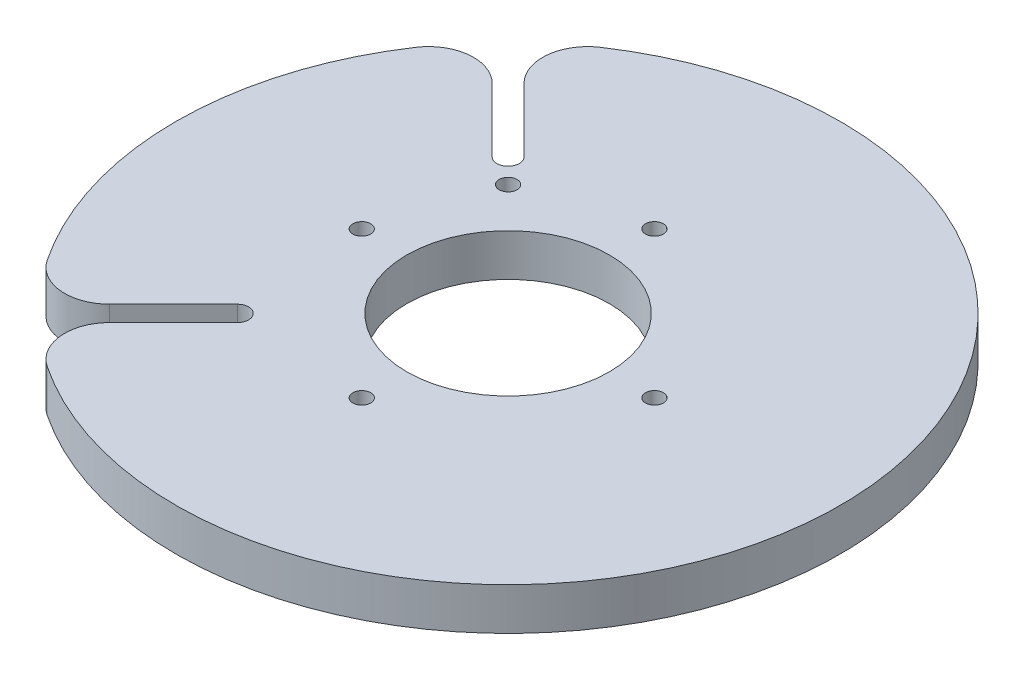
ISO-10303-21;
HEADER;
FILE_DESCRIPTION(('STEP AP214'),'2;1');
FILE_NAME('part.step','',(''),(''),'','','');
FILE_SCHEMA(('AUTOMOTIVE_DESIGN { 1 0 10303 214 1 1 1 1 }'));
ENDSEC;
DATA;
#1=APPLICATION_CONTEXT('core data for automotive mechanical design processes');
#2=APPLICATION_PROTOCOL_DEFINITION('international standard','automotive_design',2000,#1);
#3=PRODUCT_CONTEXT('',#1,'mechanical');
#4=PRODUCT('Part','Part','',(#3));
#5=PRODUCT_RELATED_PRODUCT_CATEGORY('part','',(#4));
#6=PRODUCT_DEFINITION_FORMATION('','',#4);
#7=PRODUCT_DEFINITION_CONTEXT('part definition',#1,'design');
#8=PRODUCT_DEFINITION('design','',#6,#7);
#9=PRODUCT_DEFINITION_SHAPE('','',#8);
#10=(LENGTH_UNIT() NAMED_UNIT(*) SI_UNIT(.MILLI.,.METRE.));
#11=(NAMED_UNIT(*) PLANE_ANGLE_UNIT() SI_UNIT($,.RADIAN.));
#12=(NAMED_UNIT(*) SI_UNIT($,.STERADIAN.) SOLID_ANGLE_UNIT());
#13=UNCERTAINTY_MEASURE_WITH_UNIT(LENGTH_MEASURE(1.E-05),#10,'distance_accuracy_value','');
#14=(GEOMETRIC_REPRESENTATION_CONTEXT(3) GLOBAL_UNCERTAINTY_ASSIGNED_CONTEXT((#13)) GLOBAL_UNIT_ASSIGNED_CONTEXT((#10,
#11,#12)) REPRESENTATION_CONTEXT('',''));
#15=CARTESIAN_POINT('',(0.,0.,0.));
#16=DIRECTION('',(0.,0.,1.));
#17=DIRECTION('',(1.,0.,0.));
#18=AXIS2_PLACEMENT_3D('',#15,#16,#17);
#19=CARTESIAN_POINT('',(0.,9.525,0.));
#20=DIRECTION('',(0.,-1.,0.));
#21=DIRECTION('',(0.,0.,-1.));
#22=AXIS2_PLACEMENT_3D('',#19,#20,#21);
#23=CYLINDRICAL_SURFACE('',#22,75.);
#24=CARTESIAN_POINT('',(0.,9.525,0.));
#25=DIRECTION('',(0.,1.,0.));
#26=DIRECTION('',(0.,0.,1.));
#27=AXIS2_PLACEMENT_3D('',#24,#25,#26);
#28=CIRCLE('',#27,75.);
#29=CARTESIAN_POINT('',(-41.6183838096098,9.525,62.393189765198));
#30=VERTEX_POINT('',#29);
#31=CARTESIAN_POINT('',(-41.6183838096098,9.525,-62.393189765198));
#32=VERTEX_POINT('',#31);
#33=EDGE_CURVE('E185',#30,#32,#28,.T.);
#34=ORIENTED_EDGE('',*,*,#33,.F.);
#35=DIRECTION('',(0.,-1.,0.));
#36=VECTOR('',#35,1.);
#37=CARTESIAN_POINT('',(-41.6183838096098,9.525,62.393189765198));
#38=LINE('',#37,#36);
#39=CARTESIAN_POINT('',(-41.6183838096098,0.,62.393189765198));
#40=VERTEX_POINT('',#39);
#41=EDGE_CURVE('E202',#30,#40,#38,.T.);
#42=ORIENTED_EDGE('',*,*,#41,.T.);
#43=CARTESIAN_POINT('',(0.,0.,0.));
#44=DIRECTION('',(0.,1.,0.));
#45=DIRECTION('',(0.,0.,1.));
#46=AXIS2_PLACEMENT_3D('',#43,#44,#45);
#47=CIRCLE('',#46,75.);
#48=CARTESIAN_POINT('',(-41.6183838096098,0.,-62.393189765198));
#49=VERTEX_POINT('',#48);
#50=EDGE_CURVE('E180',#40,#49,#47,.T.);
#51=ORIENTED_EDGE('',*,*,#50,.T.);
#52=DIRECTION('',(0.,-1.,0.));
#53=VECTOR('',#52,1.);
#54=CARTESIAN_POINT('',(-41.6183838096098,9.525,-62.393189765198));
#55=LINE('',#54,#53);
#56=EDGE_CURVE('E199',#49,#32,#55,.F.);
#57=ORIENTED_EDGE('',*,*,#56,.T.);
#58=EDGE_LOOP('',(#34,#42,#51,#57));
#59=FACE_BOUND('',#58,.T.);
#60=ADVANCED_FACE('F33',(#59),#23,.T.);
#61=CARTESIAN_POINT('',(-62.3931897651984,0.,-41.6183838096091));
#62=VERTEX_POINT('',#61);
#63=CARTESIAN_POINT('',(-62.3931897651984,0.,41.6183838096092));
#64=VERTEX_POINT('',#63);
#65=EDGE_CURVE('E186',#62,#64,#47,.T.);
#66=ORIENTED_EDGE('',*,*,#65,.T.);
#67=DIRECTION('',(0.,-1.,0.));
#68=VECTOR('',#67,1.);
#69=CARTESIAN_POINT('',(-62.3931897651984,9.525,41.6183838096092));
#70=LINE('',#69,#68);
#71=CARTESIAN_POINT('',(-62.3931897651984,9.525,41.6183838096092));
#72=VERTEX_POINT('',#71);
#73=EDGE_CURVE('E213',#64,#72,#70,.F.);
#74=ORIENTED_EDGE('',*,*,#73,.T.);
#75=CARTESIAN_POINT('',(-62.3931897651984,9.525,-41.6183838096091));
#76=VERTEX_POINT('',#75);
#77=EDGE_CURVE('E181',#76,#72,#28,.T.);
#78=ORIENTED_EDGE('',*,*,#77,.F.);
#79=DIRECTION('',(0.,-1.,0.));
#80=VECTOR('',#79,1.);
#81=CARTESIAN_POINT('',(-62.3931897651984,9.525,-41.6183838096091));
#82=LINE('',#81,#80);
#83=EDGE_CURVE('E211',#76,#62,#82,.T.);
#84=ORIENTED_EDGE('',*,*,#83,.T.);
#85=EDGE_LOOP('',(#66,#74,#78,#84));
#86=FACE_BOUND('',#85,.T.);
#87=ADVANCED_FACE('F251',(#86),#23,.T.);
#88=CARTESIAN_POINT('',(0.,9.525,0.));
#89=DIRECTION('',(0.,1.,0.));
#90=DIRECTION('',(0.,0.,1.));
#91=AXIS2_PLACEMENT_3D('',#88,#89,#90);
#92=PLANE('',#91);
#93=CARTESIAN_POINT('',(-25.1637927540144,9.52499999999999,-25.1637927540141));
#94=DIRECTION('',(0.,1.,0.));
#95=DIRECTION('',(0.,0.,1.));
#96=AXIS2_PLACEMENT_3D('',#93,#94,#95);
#97=CIRCLE('',#96,2.0193);
#98=CARTESIAN_POINT('',(-25.1637927540144,9.52499999999999,-23.1444927540141));
#99=VERTEX_POINT('',#98);
#100=EDGE_CURVE('E297',#99,#99,#97,.T.);
#101=ORIENTED_EDGE('',*,*,#100,.F.);
#102=EDGE_LOOP('',(#101));
#103=FACE_BOUND('',#102,.T.);
#104=CARTESIAN_POINT('',(-33.0199999999991,9.52499999999999,5.68989300120393E-13));
#105=DIRECTION('',(0.,1.,0.));
#106=DIRECTION('',(0.,0.,1.));
#107=AXIS2_PLACEMENT_3D('',#104,#105,#106);
#108=CIRCLE('',#107,2.0193);
#109=CARTESIAN_POINT('',(-33.0199999999991,9.52499999999999,2.01930000000057));
#110=VERTEX_POINT('',#109);
#111=EDGE_CURVE('E301',#110,#110,#108,.T.);
#112=ORIENTED_EDGE('',*,*,#111,.F.);
#113=EDGE_LOOP('',(#112));
#114=FACE_BOUND('',#113,.T.);
#115=CARTESIAN_POINT('',(1.63757896132211E-12,9.52499999999999,33.02));
#116=DIRECTION('',(0.,1.,0.));
#117=DIRECTION('',(0.,0.,1.));
#118=AXIS2_PLACEMENT_3D('',#115,#116,#117);
#119=CIRCLE('',#118,2.0193);
#120=CARTESIAN_POINT('',(1.63757896132211E-12,9.52499999999999,35.0393));
#121=VERTEX_POINT('',#120);
#122=EDGE_CURVE('E305',#121,#121,#119,.T.);
#123=ORIENTED_EDGE('',*,*,#122,.F.);
#124=EDGE_LOOP('',(#123));
#125=FACE_BOUND('',#124,.T.);
#126=CARTESIAN_POINT('',(33.0200000000009,9.52499999999999,-8.32667268468867E-13));
#127=DIRECTION('',(0.,1.,0.));
#128=DIRECTION('',(0.,0.,1.));
#129=AXIS2_PLACEMENT_3D('',#126,#127,#128);
#130=CIRCLE('',#129,2.01930000000001);
#131=CARTESIAN_POINT('',(33.0200000000009,9.52499999999999,2.01929999999917));
#132=VERTEX_POINT('',#131);
#133=EDGE_CURVE('E309',#132,#132,#130,.T.);
#134=ORIENTED_EDGE('',*,*,#133,.F.);
#135=EDGE_LOOP('',(#134));
#136=FACE_BOUND('',#135,.T.);
#137=CARTESIAN_POINT('',(0.,9.52499999999999,-33.02));
#138=DIRECTION('',(0.,1.,0.));
#139=DIRECTION('',(0.,0.,1.));
#140=AXIS2_PLACEMENT_3D('',#137,#138,#139);
#141=CIRCLE('',#140,2.01930000000001);
#142=CARTESIAN_POINT('',(0.,9.52499999999999,-31.0007));
#143=VERTEX_POINT('',#142);
#144=EDGE_CURVE('E313',#143,#143,#141,.T.);
#145=ORIENTED_EDGE('',*,*,#144,.F.);
#146=EDGE_LOOP('',(#145));
#147=FACE_BOUND('',#146,.T.);
#148=CARTESIAN_POINT('',(0.,9.52499999999999,0.));
#149=DIRECTION('',(0.,1.,0.));
#150=DIRECTION('',(0.,0.,1.));
#151=AXIS2_PLACEMENT_3D('',#148,#149,#150);
#152=CIRCLE('',#151,22.86);
#153=CARTESIAN_POINT('',(0.,9.52499999999999,22.86));
#154=VERTEX_POINT('',#153);
#155=EDGE_CURVE('E154',#154,#154,#152,.T.);
#156=ORIENTED_EDGE('',*,*,#155,.F.);
#157=EDGE_LOOP('',(#156));
#158=FACE_BOUND('',#157,.T.);
#159=DIRECTION('',(0.707106781186551,0.,-0.707106781186544));
#160=VECTOR('',#159,1.);
#161=CARTESIAN_POINT('',(-51.2065355051151,9.525,54.7986379535422));
#162=LINE('',#161,#160);
#163=CARTESIAN_POINT('',(-43.1646849797233,9.525,46.7567874281505));
#164=VERTEX_POINT('',#163);
#165=CARTESIAN_POINT('',(-28.7558952024421,9.525,32.3479976508694));
#166=VERTEX_POINT('',#165);
#167=EDGE_CURVE('E144',#164,#166,#162,.T.);
#168=ORIENTED_EDGE('',*,*,#167,.F.);
#169=CARTESIAN_POINT('',(-35.980480082868,9.525,53.9409923250058));
#170=DIRECTION('',(0.,1.,0.));
#171=DIRECTION('',(0.,0.,1.));
#172=AXIS2_PLACEMENT_3D('',#169,#170,#171);
#173=CIRCLE('',#172,10.16);
#174=EDGE_CURVE('E197',#164,#30,#173,.T.);
#175=ORIENTED_EDGE('',*,*,#174,.T.);
#176=ORIENTED_EDGE('',*,*,#33,.T.);
#177=CARTESIAN_POINT('',(-35.980480082868,9.525,-53.9409923250058));
#178=DIRECTION('',(0.,1.,0.));
#179=DIRECTION('',(0.,0.,1.));
#180=AXIS2_PLACEMENT_3D('',#177,#178,#179);
#181=CIRCLE('',#180,10.16);
#182=CARTESIAN_POINT('',(-43.1646849797233,9.525,-46.7567874281505));
#183=VERTEX_POINT('',#182);
#184=EDGE_CURVE('E191',#32,#183,#181,.T.);
#185=ORIENTED_EDGE('',*,*,#184,.T.);
#186=DIRECTION('',(-0.707106781186551,0.,-0.707106781186544));
#187=VECTOR('',#186,1.);
#188=CARTESIAN_POINT('',(-51.2065355051151,9.525,-54.7986379535422));
#189=LINE('',#188,#187);
#190=CARTESIAN_POINT('',(-28.7558952024421,9.525,-32.3479976508694));
#191=VERTEX_POINT('',#190);
#192=EDGE_CURVE('E171',#191,#183,#189,.T.);
#193=ORIENTED_EDGE('',*,*,#192,.F.);
#194=CARTESIAN_POINT('',(-30.5519464266559,9.525,-30.5519464266555));
#195=DIRECTION('',(0.,1.,0.));
#196=DIRECTION('',(0.,0.,1.));
#197=AXIS2_PLACEMENT_3D('',#194,#195,#196);
#198=CIRCLE('',#197,2.54);
#199=CARTESIAN_POINT('',(-32.3479976508697,9.525,-28.7558952024417));
#200=VERTEX_POINT('',#199);
#201=EDGE_CURVE('E168',#200,#191,#198,.T.);
#202=ORIENTED_EDGE('',*,*,#201,.F.);
#203=DIRECTION('',(0.707106781186551,0.,0.707106781186543));
#204=VECTOR('',#203,1.);
#205=CARTESIAN_POINT('',(-54.7986379535427,9.525,-51.2065355051145));
#206=LINE('',#205,#204);
#207=CARTESIAN_POINT('',(-46.7567874281509,9.525,-43.1646849797228));
#208=VERTEX_POINT('',#207);
#209=EDGE_CURVE('E166',#208,#200,#206,.T.);
#210=ORIENTED_EDGE('',*,*,#209,.F.);
#211=CARTESIAN_POINT('',(-53.9409923250062,9.525,-35.9804800828674));
#212=DIRECTION('',(0.,1.,0.));
#213=DIRECTION('',(0.,0.,1.));
#214=AXIS2_PLACEMENT_3D('',#211,#212,#213);
#215=CIRCLE('',#214,10.16);
#216=EDGE_CURVE('E193',#208,#76,#215,.T.);
#217=ORIENTED_EDGE('',*,*,#216,.T.);
#218=ORIENTED_EDGE('',*,*,#77,.T.);
#219=CARTESIAN_POINT('',(-53.9409923250062,9.525,35.9804800828674));
#220=DIRECTION('',(0.,1.,0.));
#221=DIRECTION('',(0.,0.,1.));
#222=AXIS2_PLACEMENT_3D('',#219,#220,#221);
#223=CIRCLE('',#222,10.16);
#224=CARTESIAN_POINT('',(-46.7567874281509,9.525,43.1646849797228));
#225=VERTEX_POINT('',#224);
#226=EDGE_CURVE('E195',#72,#225,#223,.T.);
#227=ORIENTED_EDGE('',*,*,#226,.T.);
#228=DIRECTION('',(-0.707106781186551,0.,0.707106781186544));
#229=VECTOR('',#228,1.);
#230=CARTESIAN_POINT('',(-54.7986379535427,9.525,51.2065355051145));
#231=LINE('',#230,#229);
#232=CARTESIAN_POINT('',(-32.3479976508697,9.525,28.7558952024417));
#233=VERTEX_POINT('',#232);
#234=EDGE_CURVE('E159',#233,#225,#231,.T.);
#235=ORIENTED_EDGE('',*,*,#234,.F.);
#236=CARTESIAN_POINT('',(-30.5519464266559,9.525,30.5519464266555));
#237=DIRECTION('',(0.,1.,0.));
#238=DIRECTION('',(0.,0.,-1.));
#239=AXIS2_PLACEMENT_3D('',#236,#237,#238);
#240=CIRCLE('',#239,2.53999999999999);
#241=EDGE_CURVE('E142',#166,#233,#240,.T.);
#242=ORIENTED_EDGE('',*,*,#241,.F.);
#243=EDGE_LOOP('',(#168,#175,#176,#185,#193,#202,#210,#217,#218,#227,#235,#242));
#244=FACE_BOUND('',#243,.T.);
#245=ADVANCED_FACE('F226',(#103,#114,#125,#136,#147,#158,#244),#92,.T.);
#246=CARTESIAN_POINT('',(0.,0.,0.));
#247=DIRECTION('',(0.,1.,0.));
#248=DIRECTION('',(0.,0.,1.));
#249=AXIS2_PLACEMENT_3D('',#246,#247,#248);
#250=PLANE('',#249);
#251=CARTESIAN_POINT('',(-25.1637927540144,0.,-25.1637927540141));
#252=DIRECTION('',(0.,1.,0.));
#253=DIRECTION('',(0.,0.,1.));
#254=AXIS2_PLACEMENT_3D('',#251,#252,#253);
#255=CIRCLE('',#254,2.0193);
#256=CARTESIAN_POINT('',(-25.1637927540144,0.,-23.1444927540141));
#257=VERTEX_POINT('',#256);
#258=EDGE_CURVE('E334',#257,#257,#255,.T.);
#259=ORIENTED_EDGE('',*,*,#258,.T.);
#260=EDGE_LOOP('',(#259));
#261=FACE_BOUND('',#260,.T.);
#262=CARTESIAN_POINT('',(-33.0199999999991,0.,5.68989300120393E-13));
#263=DIRECTION('',(0.,1.,0.));
#264=DIRECTION('',(0.,0.,1.));
#265=AXIS2_PLACEMENT_3D('',#262,#263,#264);
#266=CIRCLE('',#265,2.0193);
#267=CARTESIAN_POINT('',(-33.0199999999991,0.,2.01930000000057));
#268=VERTEX_POINT('',#267);
#269=EDGE_CURVE('E330',#268,#268,#266,.T.);
#270=ORIENTED_EDGE('',*,*,#269,.T.);
#271=EDGE_LOOP('',(#270));
#272=FACE_BOUND('',#271,.T.);
#273=CARTESIAN_POINT('',(1.63757896132211E-12,0.,33.02));
#274=DIRECTION('',(0.,1.,0.));
#275=DIRECTION('',(0.,0.,1.));
#276=AXIS2_PLACEMENT_3D('',#273,#274,#275);
#277=CIRCLE('',#276,2.0193);
#278=CARTESIAN_POINT('',(1.63757896132211E-12,0.,35.0393));
#279=VERTEX_POINT('',#278);
#280=EDGE_CURVE('E326',#279,#279,#277,.T.);
#281=ORIENTED_EDGE('',*,*,#280,.T.);
#282=EDGE_LOOP('',(#281));
#283=FACE_BOUND('',#282,.T.);
#284=CARTESIAN_POINT('',(33.0200000000009,0.,-8.32667268468867E-13));
#285=DIRECTION('',(0.,1.,0.));
#286=DIRECTION('',(0.,0.,1.));
#287=AXIS2_PLACEMENT_3D('',#284,#285,#286);
#288=CIRCLE('',#287,2.01930000000001);
#289=CARTESIAN_POINT('',(33.0200000000009,0.,2.01929999999917));
#290=VERTEX_POINT('',#289);
#291=EDGE_CURVE('E322',#290,#290,#288,.T.);
#292=ORIENTED_EDGE('',*,*,#291,.T.);
#293=EDGE_LOOP('',(#292));
#294=FACE_BOUND('',#293,.T.);
#295=CARTESIAN_POINT('',(0.,0.,-33.02));
#296=DIRECTION('',(0.,1.,0.));
#297=DIRECTION('',(0.,0.,1.));
#298=AXIS2_PLACEMENT_3D('',#295,#296,#297);
#299=CIRCLE('',#298,2.01930000000001);
#300=CARTESIAN_POINT('',(0.,0.,-31.0007));
#301=VERTEX_POINT('',#300);
#302=EDGE_CURVE('E317',#301,#301,#299,.T.);
#303=ORIENTED_EDGE('',*,*,#302,.T.);
#304=EDGE_LOOP('',(#303));
#305=FACE_BOUND('',#304,.T.);
#306=CARTESIAN_POINT('',(0.,0.,0.));
#307=DIRECTION('',(0.,1.,0.));
#308=DIRECTION('',(0.,0.,1.));
#309=AXIS2_PLACEMENT_3D('',#306,#307,#308);
#310=CIRCLE('',#309,22.86);
#311=CARTESIAN_POINT('',(0.,0.,22.86));
#312=VERTEX_POINT('',#311);
#313=EDGE_CURVE('E150',#312,#312,#310,.T.);
#314=ORIENTED_EDGE('',*,*,#313,.T.);
#315=EDGE_LOOP('',(#314));
#316=FACE_BOUND('',#315,.T.);
#317=ORIENTED_EDGE('',*,*,#50,.F.);
#318=CARTESIAN_POINT('',(-35.980480082868,0.,53.9409923250058));
#319=DIRECTION('',(0.,1.,0.));
#320=DIRECTION('',(0.,0.,1.));
#321=AXIS2_PLACEMENT_3D('',#318,#319,#320);
#322=CIRCLE('',#321,10.16);
#323=CARTESIAN_POINT('',(-43.1646849797233,0.,46.7567874281505));
#324=VERTEX_POINT('',#323);
#325=EDGE_CURVE('E209',#40,#324,#322,.F.);
#326=ORIENTED_EDGE('',*,*,#325,.T.);
#327=DIRECTION('',(-0.707106781186551,0.,0.707106781186544));
#328=VECTOR('',#327,1.);
#329=CARTESIAN_POINT('',(-51.2065355051151,0.,54.7986379535422));
#330=LINE('',#329,#328);
#331=CARTESIAN_POINT('',(-28.7558952024421,0.,32.3479976508694));
#332=VERTEX_POINT('',#331);
#333=EDGE_CURVE('E149',#332,#324,#330,.T.);
#334=ORIENTED_EDGE('',*,*,#333,.F.);
#335=CARTESIAN_POINT('',(-30.5519464266559,0.,30.5519464266555));
#336=DIRECTION('',(0.,1.,0.));
#337=DIRECTION('',(0.,0.,1.));
#338=AXIS2_PLACEMENT_3D('',#335,#336,#337);
#339=CIRCLE('',#338,2.53999999999999);
#340=CARTESIAN_POINT('',(-32.3479976508697,0.,28.7558952024417));
#341=VERTEX_POINT('',#340);
#342=EDGE_CURVE('E139',#341,#332,#339,.F.);
#343=ORIENTED_EDGE('',*,*,#342,.F.);
#344=DIRECTION('',(0.707106781186551,0.,-0.707106781186544));
#345=VECTOR('',#344,1.);
#346=CARTESIAN_POINT('',(-54.7986379535427,0.,51.2065355051145));
#347=LINE('',#346,#345);
#348=CARTESIAN_POINT('',(-46.7567874281509,0.,43.1646849797228));
#349=VERTEX_POINT('',#348);
#350=EDGE_CURVE('E122',#349,#341,#347,.T.);
#351=ORIENTED_EDGE('',*,*,#350,.F.);
#352=CARTESIAN_POINT('',(-53.9409923250062,0.,35.9804800828674));
#353=DIRECTION('',(0.,1.,0.));
#354=DIRECTION('',(0.,0.,1.));
#355=AXIS2_PLACEMENT_3D('',#352,#353,#354);
#356=CIRCLE('',#355,10.16);
#357=EDGE_CURVE('E207',#349,#64,#356,.F.);
#358=ORIENTED_EDGE('',*,*,#357,.T.);
#359=ORIENTED_EDGE('',*,*,#65,.F.);
#360=CARTESIAN_POINT('',(-53.9409923250062,0.,-35.9804800828674));
#361=DIRECTION('',(0.,1.,0.));
#362=DIRECTION('',(0.,0.,1.));
#363=AXIS2_PLACEMENT_3D('',#360,#361,#362);
#364=CIRCLE('',#363,10.16);
#365=CARTESIAN_POINT('',(-46.7567874281509,0.,-43.1646849797228));
#366=VERTEX_POINT('',#365);
#367=EDGE_CURVE('E54',#62,#366,#364,.F.);
#368=ORIENTED_EDGE('',*,*,#367,.T.);
#369=DIRECTION('',(-0.707106781186551,0.,-0.707106781186544));
#370=VECTOR('',#369,1.);
#371=CARTESIAN_POINT('',(-54.7986379535427,0.,-51.2065355051145));
#372=LINE('',#371,#370);
#373=CARTESIAN_POINT('',(-32.3479976508697,0.,-28.7558952024417));
#374=VERTEX_POINT('',#373);
#375=EDGE_CURVE('E176',#374,#366,#372,.T.);
#376=ORIENTED_EDGE('',*,*,#375,.F.);
#377=CARTESIAN_POINT('',(-30.5519464266559,0.,-30.5519464266555));
#378=DIRECTION('',(0.,1.,0.));
#379=DIRECTION('',(0.,0.,1.));
#380=AXIS2_PLACEMENT_3D('',#377,#378,#379);
#381=CIRCLE('',#380,2.54);
#382=CARTESIAN_POINT('',(-28.7558952024421,0.,-32.3479976508694));
#383=VERTEX_POINT('',#382);
#384=EDGE_CURVE('E132',#383,#374,#381,.F.);
#385=ORIENTED_EDGE('',*,*,#384,.F.);
#386=DIRECTION('',(0.707106781186551,0.,0.707106781186544));
#387=VECTOR('',#386,1.);
#388=CARTESIAN_POINT('',(-51.2065355051151,0.,-54.7986379535422));
#389=LINE('',#388,#387);
#390=CARTESIAN_POINT('',(-43.1646849797233,0.,-46.7567874281505));
#391=VERTEX_POINT('',#390);
#392=EDGE_CURVE('E164',#391,#383,#389,.T.);
#393=ORIENTED_EDGE('',*,*,#392,.F.);
#394=CARTESIAN_POINT('',(-35.980480082868,0.,-53.9409923250058));
#395=DIRECTION('',(0.,1.,0.));
#396=DIRECTION('',(0.,0.,1.));
#397=AXIS2_PLACEMENT_3D('',#394,#395,#396);
#398=CIRCLE('',#397,10.16);
#399=EDGE_CURVE('E204',#391,#49,#398,.F.);
#400=ORIENTED_EDGE('',*,*,#399,.T.);
#401=EDGE_LOOP('',(#317,#326,#334,#343,#351,#358,#359,#368,#376,#385,#393,#400));
#402=FACE_BOUND('',#401,.T.);
#403=ADVANCED_FACE('F147',(#261,#272,#283,#294,#305,#316,#402),#250,.F.);
#404=CARTESIAN_POINT('',(-51.2065355051151,-0.000999999999999265,-54.7986379535422));
#405=DIRECTION('',(0.707106781186544,0.,-0.707106781186551));
#406=DIRECTION('',(-0.707106781186551,0.,-0.707106781186544));
#407=AXIS2_PLACEMENT_3D('',#404,#405,#406);
#408=PLANE('',#407);
#409=ORIENTED_EDGE('',*,*,#192,.T.);
#410=DIRECTION('',(0.,-1.,0.));
#411=VECTOR('',#410,1.);
#412=CARTESIAN_POINT('',(-43.1646849797233,-0.000999999999999265,-46.7567874281505));
#413=LINE('',#412,#411);
#414=EDGE_CURVE('E11',#183,#391,#413,.T.);
#415=ORIENTED_EDGE('',*,*,#414,.T.);
#416=ORIENTED_EDGE('',*,*,#392,.T.);
#417=DIRECTION('',(0.,1.,0.));
#418=VECTOR('',#417,1.);
#419=CARTESIAN_POINT('',(-28.7558952024421,-0.000999999999999265,-32.3479976508694));
#420=LINE('',#419,#418);
#421=EDGE_CURVE('E174',#383,#191,#420,.T.);
#422=ORIENTED_EDGE('',*,*,#421,.T.);
#423=EDGE_LOOP('',(#409,#415,#416,#422));
#424=FACE_BOUND('',#423,.T.);
#425=ADVANCED_FACE('F282',(#424),#408,.F.);
#426=CARTESIAN_POINT('',(-30.5519464266559,-0.000999999999999265,-30.5519464266555));
#427=DIRECTION('',(0.,1.,0.));
#428=DIRECTION('',(0.,0.,1.));
#429=AXIS2_PLACEMENT_3D('',#426,#427,#428);
#430=CYLINDRICAL_SURFACE('',#429,2.54);
#431=ORIENTED_EDGE('',*,*,#384,.T.);
#432=DIRECTION('',(0.,1.,0.));
#433=VECTOR('',#432,1.);
#434=CARTESIAN_POINT('',(-32.3479976508697,-0.000999999999999265,-28.7558952024417));
#435=LINE('',#434,#433);
#436=EDGE_CURVE('E173',#374,#200,#435,.T.);
#437=ORIENTED_EDGE('',*,*,#436,.T.);
#438=ORIENTED_EDGE('',*,*,#201,.T.);
#439=ORIENTED_EDGE('',*,*,#421,.F.);
#440=EDGE_LOOP('',(#431,#437,#438,#439));
#441=FACE_BOUND('',#440,.T.);
#442=ADVANCED_FACE('F231',(#441),#430,.F.);
#443=CARTESIAN_POINT('',(-54.7986379535427,-0.000999999999999265,-51.2065355051145));
#444=DIRECTION('',(-0.707106781186544,0.,0.707106781186551));
#445=DIRECTION('',(0.707106781186551,0.,0.707106781186544));
#446=AXIS2_PLACEMENT_3D('',#443,#444,#445);
#447=PLANE('',#446);
#448=ORIENTED_EDGE('',*,*,#375,.T.);
#449=DIRECTION('',(0.,-1.,0.));
#450=VECTOR('',#449,1.);
#451=CARTESIAN_POINT('',(-46.7567874281509,-0.000999999999999265,-43.1646849797228));
#452=LINE('',#451,#450);
#453=EDGE_CURVE('E41',#366,#208,#452,.F.);
#454=ORIENTED_EDGE('',*,*,#453,.T.);
#455=ORIENTED_EDGE('',*,*,#209,.T.);
#456=ORIENTED_EDGE('',*,*,#436,.F.);
#457=EDGE_LOOP('',(#448,#454,#455,#456));
#458=FACE_BOUND('',#457,.T.);
#459=ADVANCED_FACE('F220',(#458),#447,.F.);
#460=CARTESIAN_POINT('',(-30.5519464266559,-0.000999999999999265,30.5519464266555));
#461=DIRECTION('',(0.,1.,0.));
#462=DIRECTION('',(0.,0.,1.));
#463=AXIS2_PLACEMENT_3D('',#460,#461,#462);
#464=CYLINDRICAL_SURFACE('',#463,2.53999999999999);
#465=ORIENTED_EDGE('',*,*,#342,.T.);
#466=DIRECTION('',(0.,1.,0.));
#467=VECTOR('',#466,1.);
#468=CARTESIAN_POINT('',(-28.7558952024421,-0.000999999999999265,32.3479976508694));
#469=LINE('',#468,#467);
#470=EDGE_CURVE('E133',#332,#166,#469,.T.);
#471=ORIENTED_EDGE('',*,*,#470,.T.);
#472=ORIENTED_EDGE('',*,*,#241,.T.);
#473=DIRECTION('',(0.,1.,0.));
#474=VECTOR('',#473,1.);
#475=CARTESIAN_POINT('',(-32.3479976508697,-0.000999999999999265,28.7558952024417));
#476=LINE('',#475,#474);
#477=EDGE_CURVE('E126',#341,#233,#476,.T.);
#478=ORIENTED_EDGE('',*,*,#477,.F.);
#479=EDGE_LOOP('',(#465,#471,#472,#478));
#480=FACE_BOUND('',#479,.T.);
#481=ADVANCED_FACE('F137',(#480),#464,.F.);
#482=CARTESIAN_POINT('',(-51.2065355051151,-0.000999999999999265,54.7986379535422));
#483=DIRECTION('',(0.707106781186544,0.,0.707106781186551));
#484=DIRECTION('',(0.707106781186551,0.,-0.707106781186544));
#485=AXIS2_PLACEMENT_3D('',#482,#483,#484);
#486=PLANE('',#485);
#487=ORIENTED_EDGE('',*,*,#333,.T.);
#488=DIRECTION('',(0.,-1.,0.));
#489=VECTOR('',#488,1.);
#490=CARTESIAN_POINT('',(-43.1646849797233,-0.000999999999999265,46.7567874281505));
#491=LINE('',#490,#489);
#492=EDGE_CURVE('E184',#324,#164,#491,.F.);
#493=ORIENTED_EDGE('',*,*,#492,.T.);
#494=ORIENTED_EDGE('',*,*,#167,.T.);
#495=ORIENTED_EDGE('',*,*,#470,.F.);
#496=EDGE_LOOP('',(#487,#493,#494,#495));
#497=FACE_BOUND('',#496,.T.);
#498=ADVANCED_FACE('F246',(#497),#486,.F.);
#499=CARTESIAN_POINT('',(-54.7986379535427,-0.000999999999999265,51.2065355051145));
#500=DIRECTION('',(-0.707106781186544,0.,-0.707106781186551));
#501=DIRECTION('',(-0.707106781186551,0.,0.707106781186544));
#502=AXIS2_PLACEMENT_3D('',#499,#500,#501);
#503=PLANE('',#502);
#504=ORIENTED_EDGE('',*,*,#234,.T.);
#505=DIRECTION('',(0.,-1.,0.));
#506=VECTOR('',#505,1.);
#507=CARTESIAN_POINT('',(-46.7567874281509,-0.000999999999999265,43.1646849797228));
#508=LINE('',#507,#506);
#509=EDGE_CURVE('E129',#225,#349,#508,.T.);
#510=ORIENTED_EDGE('',*,*,#509,.T.);
#511=ORIENTED_EDGE('',*,*,#350,.T.);
#512=ORIENTED_EDGE('',*,*,#477,.T.);
#513=EDGE_LOOP('',(#504,#510,#511,#512));
#514=FACE_BOUND('',#513,.T.);
#515=ADVANCED_FACE('F125',(#514),#503,.F.);
#516=CARTESIAN_POINT('',(-35.980480082868,9.525,53.9409923250058));
#517=DIRECTION('',(0.,-1.,0.));
#518=DIRECTION('',(0.,0.,-1.));
#519=AXIS2_PLACEMENT_3D('',#516,#517,#518);
#520=CYLINDRICAL_SURFACE('',#519,10.16);
#521=ORIENTED_EDGE('',*,*,#325,.F.);
#522=ORIENTED_EDGE('',*,*,#41,.F.);
#523=ORIENTED_EDGE('',*,*,#174,.F.);
#524=ORIENTED_EDGE('',*,*,#492,.F.);
#525=EDGE_LOOP('',(#521,#522,#523,#524));
#526=FACE_BOUND('',#525,.T.);
#527=ADVANCED_FACE('F244',(#526),#520,.T.);
#528=CARTESIAN_POINT('',(-53.9409923250062,9.525,35.9804800828674));
#529=DIRECTION('',(0.,-1.,0.));
#530=DIRECTION('',(0.,0.,-1.));
#531=AXIS2_PLACEMENT_3D('',#528,#529,#530);
#532=CYLINDRICAL_SURFACE('',#531,10.16);
#533=ORIENTED_EDGE('',*,*,#357,.F.);
#534=ORIENTED_EDGE('',*,*,#509,.F.);
#535=ORIENTED_EDGE('',*,*,#226,.F.);
#536=ORIENTED_EDGE('',*,*,#73,.F.);
#537=EDGE_LOOP('',(#533,#534,#535,#536));
#538=FACE_BOUND('',#537,.T.);
#539=ADVANCED_FACE('F248',(#538),#532,.T.);
#540=CARTESIAN_POINT('',(-53.9409923250062,9.525,-35.9804800828674));
#541=DIRECTION('',(0.,-1.,0.));
#542=DIRECTION('',(0.,0.,-1.));
#543=AXIS2_PLACEMENT_3D('',#540,#541,#542);
#544=CYLINDRICAL_SURFACE('',#543,10.16);
#545=ORIENTED_EDGE('',*,*,#367,.F.);
#546=ORIENTED_EDGE('',*,*,#83,.F.);
#547=ORIENTED_EDGE('',*,*,#216,.F.);
#548=ORIENTED_EDGE('',*,*,#453,.F.);
#549=EDGE_LOOP('',(#545,#546,#547,#548));
#550=FACE_BOUND('',#549,.T.);
#551=ADVANCED_FACE('F253',(#550),#544,.T.);
#552=CARTESIAN_POINT('',(-35.980480082868,9.525,-53.9409923250058));
#553=DIRECTION('',(0.,-1.,0.));
#554=DIRECTION('',(0.,0.,-1.));
#555=AXIS2_PLACEMENT_3D('',#552,#553,#554);
#556=CYLINDRICAL_SURFACE('',#555,10.16);
#557=ORIENTED_EDGE('',*,*,#399,.F.);
#558=ORIENTED_EDGE('',*,*,#414,.F.);
#559=ORIENTED_EDGE('',*,*,#184,.F.);
#560=ORIENTED_EDGE('',*,*,#56,.F.);
#561=EDGE_LOOP('',(#557,#558,#559,#560));
#562=FACE_BOUND('',#561,.T.);
#563=ADVANCED_FACE('F35',(#562),#556,.T.);
#564=CARTESIAN_POINT('',(0.,0.,0.));
#565=DIRECTION('',(0.,1.,0.));
#566=DIRECTION('',(0.,0.,1.));
#567=AXIS2_PLACEMENT_3D('',#564,#565,#566);
#568=CYLINDRICAL_SURFACE('',#567,22.86);
#569=ORIENTED_EDGE('',*,*,#313,.F.);
#570=EDGE_LOOP('',(#569));
#571=FACE_BOUND('',#570,.T.);
#572=ORIENTED_EDGE('',*,*,#155,.T.);
#573=EDGE_LOOP('',(#572));
#574=FACE_BOUND('',#573,.T.);
#575=ADVANCED_FACE('F259',(#571,#574),#568,.F.);
#576=CARTESIAN_POINT('',(0.,0.,-33.02));
#577=DIRECTION('',(0.,1.,0.));
#578=DIRECTION('',(0.,0.,1.));
#579=AXIS2_PLACEMENT_3D('',#576,#577,#578);
#580=CYLINDRICAL_SURFACE('',#579,2.01930000000001);
#581=ORIENTED_EDGE('',*,*,#302,.F.);
#582=EDGE_LOOP('',(#581));
#583=FACE_BOUND('',#582,.T.);
#584=ORIENTED_EDGE('',*,*,#144,.T.);
#585=EDGE_LOOP('',(#584));
#586=FACE_BOUND('',#585,.T.);
#587=ADVANCED_FACE('F360',(#583,#586),#580,.F.);
#588=CARTESIAN_POINT('',(33.0200000000009,0.,-8.32667268468867E-13));
#589=DIRECTION('',(0.,1.,0.));
#590=DIRECTION('',(0.,0.,1.));
#591=AXIS2_PLACEMENT_3D('',#588,#589,#590);
#592=CYLINDRICAL_SURFACE('',#591,2.01930000000001);
#593=ORIENTED_EDGE('',*,*,#291,.F.);
#594=EDGE_LOOP('',(#593));
#595=FACE_BOUND('',#594,.T.);
#596=ORIENTED_EDGE('',*,*,#133,.T.);
#597=EDGE_LOOP('',(#596));
#598=FACE_BOUND('',#597,.T.);
#599=ADVANCED_FACE('F356',(#595,#598),#592,.F.);
#600=CARTESIAN_POINT('',(1.63757896132211E-12,0.,33.02));
#601=DIRECTION('',(0.,1.,0.));
#602=DIRECTION('',(0.,0.,1.));
#603=AXIS2_PLACEMENT_3D('',#600,#601,#602);
#604=CYLINDRICAL_SURFACE('',#603,2.0193);
#605=ORIENTED_EDGE('',*,*,#280,.F.);
#606=EDGE_LOOP('',(#605));
#607=FACE_BOUND('',#606,.T.);
#608=ORIENTED_EDGE('',*,*,#122,.T.);
#609=EDGE_LOOP('',(#608));
#610=FACE_BOUND('',#609,.T.);
#611=ADVANCED_FACE('F350',(#607,#610),#604,.F.);
#612=CARTESIAN_POINT('',(-33.0199999999991,0.,5.68989300120393E-13));
#613=DIRECTION('',(0.,1.,0.));
#614=DIRECTION('',(0.,0.,1.));
#615=AXIS2_PLACEMENT_3D('',#612,#613,#614);
#616=CYLINDRICAL_SURFACE('',#615,2.0193);
#617=ORIENTED_EDGE('',*,*,#269,.F.);
#618=EDGE_LOOP('',(#617));
#619=FACE_BOUND('',#618,.T.);
#620=ORIENTED_EDGE('',*,*,#111,.T.);
#621=EDGE_LOOP('',(#620));
#622=FACE_BOUND('',#621,.T.);
#623=ADVANCED_FACE('F345',(#619,#622),#616,.F.);
#624=CARTESIAN_POINT('',(-25.1637927540144,0.,-25.1637927540141));
#625=DIRECTION('',(0.,1.,0.));
#626=DIRECTION('',(0.,0.,1.));
#627=AXIS2_PLACEMENT_3D('',#624,#625,#626);
#628=CYLINDRICAL_SURFACE('',#627,2.0193);
#629=ORIENTED_EDGE('',*,*,#258,.F.);
#630=EDGE_LOOP('',(#629));
#631=FACE_BOUND('',#630,.T.);
#632=ORIENTED_EDGE('',*,*,#100,.T.);
#633=EDGE_LOOP('',(#632));
#634=FACE_BOUND('',#633,.T.);
#635=ADVANCED_FACE('F342',(#631,#634),#628,.F.);
#636=CLOSED_SHELL('',(#60,#87,#245,#403,#425,#442,#459,#481,#498,#515,#527,#539,#551,#563,#575,
#587,#599,#611,#623,#635));
#637=MANIFOLD_SOLID_BREP('B2',#636);
#638=ADVANCED_BREP_SHAPE_REPRESENTATION('',(#18,#637),#14);
#639=SHAPE_DEFINITION_REPRESENTATION(#9,#638);
ENDSEC;
END-ISO-10303-21;
